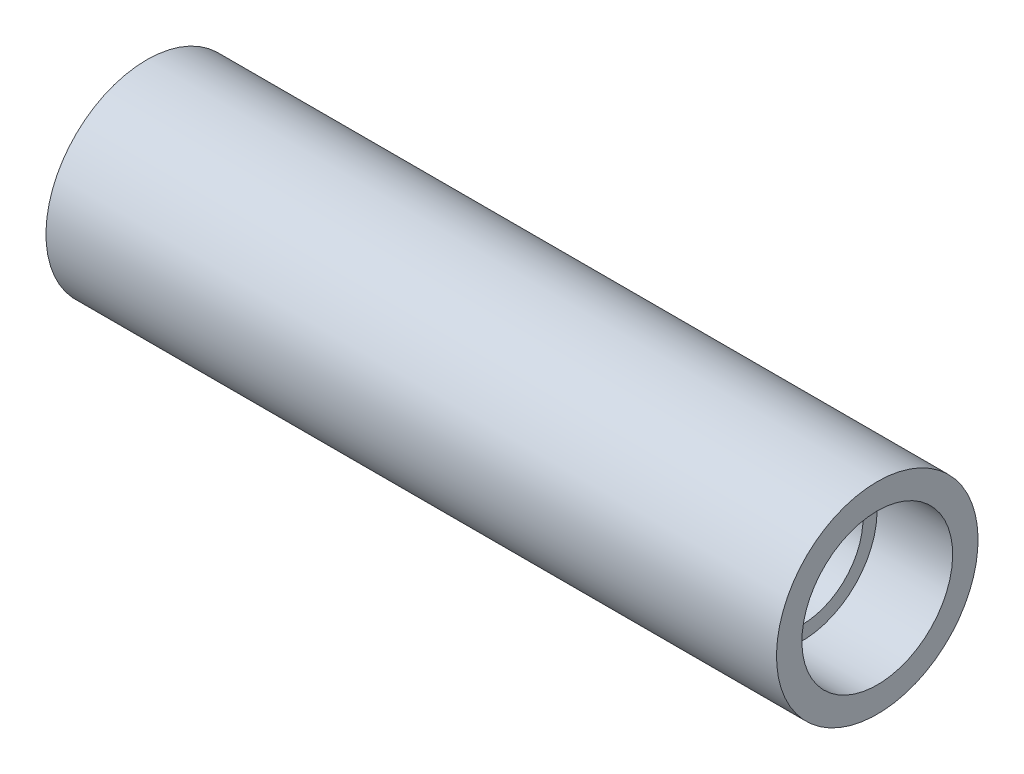
ISO-10303-21;
HEADER;
FILE_DESCRIPTION(('STEP AP214'),'2;1');
FILE_NAME('part.step','',(''),(''),'','','');
FILE_SCHEMA(('AUTOMOTIVE_DESIGN { 1 0 10303 214 1 1 1 1 }'));
ENDSEC;
DATA;
#1=APPLICATION_CONTEXT('core data for automotive mechanical design processes');
#2=APPLICATION_PROTOCOL_DEFINITION('international standard','automotive_design',2000,#1);
#3=PRODUCT_CONTEXT('',#1,'mechanical');
#4=PRODUCT('Part','Part','',(#3));
#5=PRODUCT_RELATED_PRODUCT_CATEGORY('part','',(#4));
#6=PRODUCT_DEFINITION_FORMATION('','',#4);
#7=PRODUCT_DEFINITION_CONTEXT('part definition',#1,'design');
#8=PRODUCT_DEFINITION('design','',#6,#7);
#9=PRODUCT_DEFINITION_SHAPE('','',#8);
#10=(LENGTH_UNIT() NAMED_UNIT(*) SI_UNIT(.MILLI.,.METRE.));
#11=(NAMED_UNIT(*) PLANE_ANGLE_UNIT() SI_UNIT($,.RADIAN.));
#12=(NAMED_UNIT(*) SI_UNIT($,.STERADIAN.) SOLID_ANGLE_UNIT());
#13=UNCERTAINTY_MEASURE_WITH_UNIT(LENGTH_MEASURE(1.E-05),#10,'distance_accuracy_value','');
#14=(GEOMETRIC_REPRESENTATION_CONTEXT(3) GLOBAL_UNCERTAINTY_ASSIGNED_CONTEXT((#13)) GLOBAL_UNIT_ASSIGNED_CONTEXT((#10,
#11,#12)) REPRESENTATION_CONTEXT('',''));
#15=CARTESIAN_POINT('',(0.,0.,0.));
#16=DIRECTION('',(0.,0.,1.));
#17=DIRECTION('',(1.,0.,0.));
#18=AXIS2_PLACEMENT_3D('',#15,#16,#17);
#19=CARTESIAN_POINT('',(2.38124999999999,3.175,0.));
#20=DIRECTION('',(1.,0.,0.));
#21=DIRECTION('',(0.,1.,0.));
#22=AXIS2_PLACEMENT_3D('',#19,#20,#21);
#23=PLANE('',#22);
#24=CARTESIAN_POINT('',(2.38124999999998,3.17500000000003,0.));
#25=DIRECTION('',(1.,0.,0.));
#26=DIRECTION('',(0.,1.,0.));
#27=AXIS2_PLACEMENT_3D('',#24,#25,#26);
#28=CIRCLE('',#27,2.37490000000003);
#29=CARTESIAN_POINT('',(2.38124999999997,5.54990000000006,0.));
#30=VERTEX_POINT('',#29);
#31=EDGE_CURVE('E67',#30,#30,#28,.T.);
#32=ORIENTED_EDGE('',*,*,#31,.F.);
#33=EDGE_LOOP('',(#32));
#34=FACE_BOUND('',#33,.T.);
#35=CARTESIAN_POINT('',(2.38124999999999,3.17500000000003,0.));
#36=DIRECTION('',(-1.,0.,0.));
#37=DIRECTION('',(0.,0.,1.));
#38=AXIS2_PLACEMENT_3D('',#35,#36,#37);
#39=CIRCLE('',#38,1.93039999999999);
#40=CARTESIAN_POINT('',(2.38124999999999,3.17500000000003,1.93039999999999));
#41=VERTEX_POINT('',#40);
#42=EDGE_CURVE('E79',#41,#41,#39,.T.);
#43=ORIENTED_EDGE('',*,*,#42,.F.);
#44=EDGE_LOOP('',(#43));
#45=FACE_BOUND('',#44,.T.);
#46=ADVANCED_FACE('F43',(#34,#45),#23,.F.);
#47=CARTESIAN_POINT('',(0.,0.800099999999999,0.));
#48=DIRECTION('',(1.,0.,0.));
#49=DIRECTION('',(0.,1.,0.));
#50=AXIS2_PLACEMENT_3D('',#47,#48,#49);
#51=PLANE('',#50);
#52=CARTESIAN_POINT('',(0.,3.17500000000001,0.));
#53=DIRECTION('',(1.,0.,0.));
#54=DIRECTION('',(0.,1.,0.));
#55=AXIS2_PLACEMENT_3D('',#52,#53,#54);
#56=CIRCLE('',#55,3.17500000000001);
#57=CARTESIAN_POINT('',(0.,6.35000000000002,0.));
#58=VERTEX_POINT('',#57);
#59=EDGE_CURVE('E10',#58,#58,#56,.T.);
#60=ORIENTED_EDGE('',*,*,#59,.F.);
#61=EDGE_LOOP('',(#60));
#62=FACE_BOUND('',#61,.T.);
#63=CARTESIAN_POINT('',(0.,3.17500000000001,0.));
#64=DIRECTION('',(1.,0.,0.));
#65=DIRECTION('',(0.,1.,0.));
#66=AXIS2_PLACEMENT_3D('',#63,#64,#65);
#67=CIRCLE('',#66,2.37490000000001);
#68=CARTESIAN_POINT('',(0.,5.54990000000002,0.));
#69=VERTEX_POINT('',#68);
#70=EDGE_CURVE('E71',#69,#69,#67,.T.);
#71=ORIENTED_EDGE('',*,*,#70,.T.);
#72=EDGE_LOOP('',(#71));
#73=FACE_BOUND('',#72,.T.);
#74=ADVANCED_FACE('F45',(#62,#73),#51,.F.);
#75=CARTESIAN_POINT('',(1.61318770226539,3.17500000000002,0.));
#76=DIRECTION('',(1.,0.,0.));
#77=DIRECTION('',(0.,1.,0.));
#78=AXIS2_PLACEMENT_3D('',#75,#76,#77);
#79=CYLINDRICAL_SURFACE('',#78,3.17500000000009);
#80=CARTESIAN_POINT('',(23.01875,3.17500000000017,0.));
#81=DIRECTION('',(1.,0.,0.));
#82=DIRECTION('',(0.,1.,0.));
#83=AXIS2_PLACEMENT_3D('',#80,#81,#82);
#84=CIRCLE('',#83,3.17500000000017);
#85=CARTESIAN_POINT('',(23.01875,6.35000000000034,0.));
#86=VERTEX_POINT('',#85);
#87=EDGE_CURVE('E51',#86,#86,#84,.T.);
#88=ORIENTED_EDGE('',*,*,#87,.F.);
#89=EDGE_LOOP('',(#88));
#90=FACE_BOUND('',#89,.T.);
#91=ORIENTED_EDGE('',*,*,#59,.T.);
#92=EDGE_LOOP('',(#91));
#93=FACE_BOUND('',#92,.T.);
#94=ADVANCED_FACE('F94',(#90,#93),#79,.T.);
#95=CARTESIAN_POINT('',(23.01875,0.,0.));
#96=DIRECTION('',(-1.,0.,0.));
#97=DIRECTION('',(0.,-1.,0.));
#98=AXIS2_PLACEMENT_3D('',#95,#96,#97);
#99=PLANE('',#98);
#100=CARTESIAN_POINT('',(23.01875,3.17500000000017,0.));
#101=DIRECTION('',(1.,0.,0.));
#102=DIRECTION('',(0.,1.,0.));
#103=AXIS2_PLACEMENT_3D('',#100,#101,#102);
#104=CIRCLE('',#103,2.37490000000017);
#105=CARTESIAN_POINT('',(23.01875,5.54990000000034,0.));
#106=VERTEX_POINT('',#105);
#107=EDGE_CURVE('E56',#106,#106,#104,.T.);
#108=ORIENTED_EDGE('',*,*,#107,.F.);
#109=EDGE_LOOP('',(#108));
#110=FACE_BOUND('',#109,.T.);
#111=ORIENTED_EDGE('',*,*,#87,.T.);
#112=EDGE_LOOP('',(#111));
#113=FACE_BOUND('',#112,.T.);
#114=ADVANCED_FACE('F107',(#110,#113),#99,.F.);
#115=CARTESIAN_POINT('',(1.61318770226539,3.17500000000002,0.));
#116=DIRECTION('',(1.,0.,0.));
#117=DIRECTION('',(0.,1.,0.));
#118=AXIS2_PLACEMENT_3D('',#115,#116,#117);
#119=CYLINDRICAL_SURFACE('',#118,2.37490000000016);
#120=CARTESIAN_POINT('',(20.6375,3.17500000000016,0.));
#121=DIRECTION('',(1.,0.,0.));
#122=DIRECTION('',(0.,1.,0.));
#123=AXIS2_PLACEMENT_3D('',#120,#121,#122);
#124=CIRCLE('',#123,2.37490000000015);
#125=CARTESIAN_POINT('',(20.6375,5.54990000000031,0.));
#126=VERTEX_POINT('',#125);
#127=EDGE_CURVE('E61',#126,#126,#124,.T.);
#128=ORIENTED_EDGE('',*,*,#127,.F.);
#129=EDGE_LOOP('',(#128));
#130=FACE_BOUND('',#129,.T.);
#131=ORIENTED_EDGE('',*,*,#107,.T.);
#132=EDGE_LOOP('',(#131));
#133=FACE_BOUND('',#132,.T.);
#134=ADVANCED_FACE('F103',(#130,#133),#119,.F.);
#135=CARTESIAN_POINT('',(20.6375,0.800100000000002,0.));
#136=DIRECTION('',(-1.,0.,0.));
#137=DIRECTION('',(0.,-1.,0.));
#138=AXIS2_PLACEMENT_3D('',#135,#136,#137);
#139=PLANE('',#138);
#140=CARTESIAN_POINT('',(20.6375,3.17500000000003,0.));
#141=DIRECTION('',(-1.,0.,0.));
#142=DIRECTION('',(0.,-1.,0.));
#143=AXIS2_PLACEMENT_3D('',#140,#141,#142);
#144=CIRCLE('',#143,1.93039999999999);
#145=CARTESIAN_POINT('',(20.6375,1.24460000000004,0.));
#146=VERTEX_POINT('',#145);
#147=EDGE_CURVE('E75',#146,#146,#144,.T.);
#148=ORIENTED_EDGE('',*,*,#147,.T.);
#149=EDGE_LOOP('',(#148));
#150=FACE_BOUND('',#149,.T.);
#151=ORIENTED_EDGE('',*,*,#127,.T.);
#152=EDGE_LOOP('',(#151));
#153=FACE_BOUND('',#152,.T.);
#154=ADVANCED_FACE('F101',(#150,#153),#139,.F.);
#155=CARTESIAN_POINT('',(1.61318770226539,3.17500000000002,0.));
#156=DIRECTION('',(1.,0.,0.));
#157=DIRECTION('',(0.,1.,0.));
#158=AXIS2_PLACEMENT_3D('',#155,#156,#157);
#159=CYLINDRICAL_SURFACE('',#158,2.37490000000002);
#160=ORIENTED_EDGE('',*,*,#70,.F.);
#161=EDGE_LOOP('',(#160));
#162=FACE_BOUND('',#161,.T.);
#163=ORIENTED_EDGE('',*,*,#31,.T.);
#164=EDGE_LOOP('',(#163));
#165=FACE_BOUND('',#164,.T.);
#166=ADVANCED_FACE('F99',(#162,#165),#159,.F.);
#167=CARTESIAN_POINT('',(2.38124999999999,3.17500000000003,0.));
#168=DIRECTION('',(-1.,0.,0.));
#169=DIRECTION('',(0.,0.,1.));
#170=AXIS2_PLACEMENT_3D('',#167,#168,#169);
#171=CYLINDRICAL_SURFACE('',#170,1.93039999999999);
#172=ORIENTED_EDGE('',*,*,#147,.F.);
#173=EDGE_LOOP('',(#172));
#174=FACE_BOUND('',#173,.T.);
#175=ORIENTED_EDGE('',*,*,#42,.T.);
#176=EDGE_LOOP('',(#175));
#177=FACE_BOUND('',#176,.T.);
#178=ADVANCED_FACE('F84',(#174,#177),#171,.F.);
#179=CLOSED_SHELL('',(#46,#74,#94,#114,#134,#154,#166,#178));
#180=MANIFOLD_SOLID_BREP('B2',#179);
#181=ADVANCED_BREP_SHAPE_REPRESENTATION('',(#18,#180),#14);
#182=SHAPE_DEFINITION_REPRESENTATION(#9,#181);
ENDSEC;
END-ISO-10303-21;
